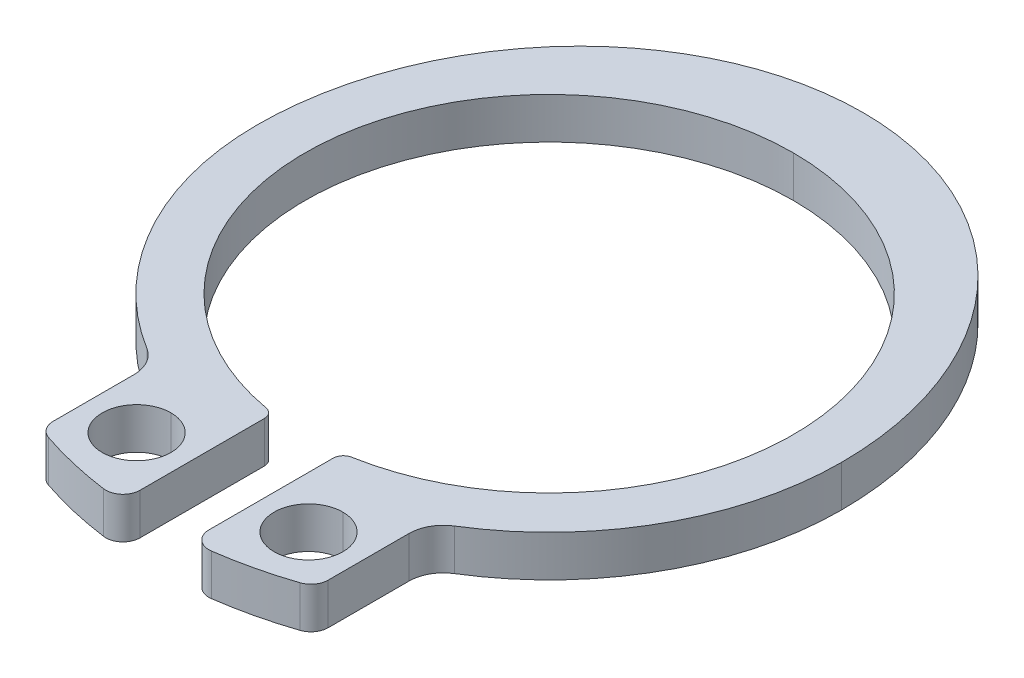
ISO-10303-21;
HEADER;
FILE_DESCRIPTION(('STEP AP214'),'2;1');
FILE_NAME('part.step','',(''),(''),'','','');
FILE_SCHEMA(('AUTOMOTIVE_DESIGN { 1 0 10303 214 1 1 1 1 }'));
ENDSEC;
DATA;
#1=APPLICATION_CONTEXT('core data for automotive mechanical design processes');
#2=APPLICATION_PROTOCOL_DEFINITION('international standard','automotive_design',2000,#1);
#3=PRODUCT_CONTEXT('',#1,'mechanical');
#4=PRODUCT('Part','Part','',(#3));
#5=PRODUCT_RELATED_PRODUCT_CATEGORY('part','',(#4));
#6=PRODUCT_DEFINITION_FORMATION('','',#4);
#7=PRODUCT_DEFINITION_CONTEXT('part definition',#1,'design');
#8=PRODUCT_DEFINITION('design','',#6,#7);
#9=PRODUCT_DEFINITION_SHAPE('','',#8);
#10=(LENGTH_UNIT() NAMED_UNIT(*) SI_UNIT(.MILLI.,.METRE.));
#11=(NAMED_UNIT(*) PLANE_ANGLE_UNIT() SI_UNIT($,.RADIAN.));
#12=(NAMED_UNIT(*) SI_UNIT($,.STERADIAN.) SOLID_ANGLE_UNIT());
#13=UNCERTAINTY_MEASURE_WITH_UNIT(LENGTH_MEASURE(1.E-05),#10,'distance_accuracy_value','');
#14=(GEOMETRIC_REPRESENTATION_CONTEXT(3) GLOBAL_UNCERTAINTY_ASSIGNED_CONTEXT((#13)) GLOBAL_UNIT_ASSIGNED_CONTEXT((#10,
#11,#12)) REPRESENTATION_CONTEXT('',''));
#15=CARTESIAN_POINT('',(0.,0.,0.));
#16=DIRECTION('',(0.,0.,1.));
#17=DIRECTION('',(1.,0.,0.));
#18=AXIS2_PLACEMENT_3D('',#15,#16,#17);
#19=CARTESIAN_POINT('',(8.5,1.2,0.));
#20=CARTESIAN_POINT('',(8.5,0.,0.));
#21=CARTESIAN_POINT('',(8.5,1.2,-5.347243652));
#22=CARTESIAN_POINT('',(8.5,0.,-5.347243652));
#23=CARTESIAN_POINT('',(4.97918472,1.2,-9.128315899));
#24=CARTESIAN_POINT('',(4.97918472,0.,-9.128315899));
#25=CARTESIAN_POINT('',(0.,1.2,-9.128315899));
#26=CARTESIAN_POINT('',(0.,0.,-9.128315899));
#27=(BOUNDED_SURFACE() B_SPLINE_SURFACE(3,1,((#19,#20),(#21,#22),(#23,#24),(#25,#26)),
.UNSPECIFIED.,.F.,.F.,.F.) B_SPLINE_SURFACE_WITH_KNOTS((4,4),(2,2),(0.,1.),(0.,1.),
.UNSPECIFIED.) GEOMETRIC_REPRESENTATION_ITEM() RATIONAL_B_SPLINE_SURFACE(((1.,1.),
(0.804737854124365,0.804737854124365),(0.804737854124365,0.804737854124365),(1.,1.))) REPRESENTATION_ITEM('') SURFACE());
#28=CARTESIAN_POINT('',(8.5,1.2,1.74337725500117E-09));
#29=CARTESIAN_POINT('',(8.5,1.2,-5.347243652));
#30=CARTESIAN_POINT('',(4.97918472,1.2,-9.128315899));
#31=CARTESIAN_POINT('',(0.,1.2,-9.128315899));
#32=(BOUNDED_CURVE() B_SPLINE_CURVE(3,(#28,#29,#30,#31),.UNSPECIFIED.,.F.,
.F.) B_SPLINE_CURVE_WITH_KNOTS((4,4),(0.,0.0138518875683567),
.UNSPECIFIED.) CURVE() GEOMETRIC_REPRESENTATION_ITEM() RATIONAL_B_SPLINE_CURVE((1.,
0.804737854124365,0.804737854124365,1.)) REPRESENTATION_ITEM(''));
#33=CARTESIAN_POINT('',(8.5,1.2,1.74337725500117E-09));
#34=VERTEX_POINT('',#33);
#35=CARTESIAN_POINT('',(0.,1.2,-9.128315899));
#36=VERTEX_POINT('',#35);
#37=EDGE_CURVE('E408',#34,#36,#32,.T.);
#38=DIRECTION('',(0.,-1.,0.));
#39=VECTOR('',#38,1.);
#40=CARTESIAN_POINT('',(8.5,0.6,1.74337725500117E-09));
#41=LINE('',#40,#39);
#42=CARTESIAN_POINT('',(8.5,0.,2.07655758405907E-10));
#43=VERTEX_POINT('',#42);
#44=EDGE_CURVE('E468',#34,#43,#41,.T.);
#45=CARTESIAN_POINT('',(8.5,0.,2.07655758405907E-10));
#46=CARTESIAN_POINT('',(8.5,0.,-5.347243652));
#47=CARTESIAN_POINT('',(4.97918472,0.,-9.128315899));
#48=CARTESIAN_POINT('',(0.,0.,-9.128315899));
#49=(BOUNDED_CURVE() B_SPLINE_CURVE(3,(#45,#46,#47,#48),.UNSPECIFIED.,.F.,
.F.) B_SPLINE_CURVE_WITH_KNOTS((4,4),(0.,0.0138518875683567),
.UNSPECIFIED.) CURVE() GEOMETRIC_REPRESENTATION_ITEM() RATIONAL_B_SPLINE_CURVE((1.,
0.804737854124365,0.804737854124365,1.)) REPRESENTATION_ITEM(''));
#50=CARTESIAN_POINT('',(0.,0.,-9.128315899));
#51=VERTEX_POINT('',#50);
#52=EDGE_CURVE('E296',#43,#51,#49,.T.);
#53=DIRECTION('',(0.,1.,0.));
#54=VECTOR('',#53,1.);
#55=CARTESIAN_POINT('',(0.,0.6,-9.128315899));
#56=LINE('',#55,#54);
#57=EDGE_CURVE('E11',#51,#36,#56,.T.);
#58=ORIENTED_EDGE('',*,*,#37,.F.);
#59=ORIENTED_EDGE('',*,*,#44,.T.);
#60=ORIENTED_EDGE('',*,*,#52,.T.);
#61=ORIENTED_EDGE('',*,*,#57,.T.);
#62=EDGE_LOOP('',(#58,#59,#60,#61));
#63=FACE_BOUND('',#62,.T.);
#64=ADVANCED_FACE('F16',(#63),#27,.F.);
#65=CARTESIAN_POINT('',(0.,1.2,-9.128315899));
#66=CARTESIAN_POINT('',(0.,0.,-9.128315899));
#67=CARTESIAN_POINT('',(-4.97918472,1.2,-9.128315899));
#68=CARTESIAN_POINT('',(-4.97918472,0.,-9.128315899));
#69=CARTESIAN_POINT('',(-8.5,1.2,-5.347243652));
#70=CARTESIAN_POINT('',(-8.5,0.,-5.347243652));
#71=CARTESIAN_POINT('',(-8.5,1.2,0.));
#72=CARTESIAN_POINT('',(-8.5,0.,0.));
#73=(BOUNDED_SURFACE() B_SPLINE_SURFACE(3,1,((#65,#66),(#67,#68),(#69,#70),(#71,#72)),
.UNSPECIFIED.,.F.,.F.,.F.) B_SPLINE_SURFACE_WITH_KNOTS((4,4),(2,2),(0.,1.),(0.,1.),
.UNSPECIFIED.) GEOMETRIC_REPRESENTATION_ITEM() RATIONAL_B_SPLINE_SURFACE(((1.,1.),
(0.804737854124365,0.804737854124365),(0.804737854124365,0.804737854124365),(1.,1.))) REPRESENTATION_ITEM('') SURFACE());
#74=CARTESIAN_POINT('',(0.,0.,-9.128315899));
#75=CARTESIAN_POINT('',(-4.97918472,0.,-9.128315899));
#76=CARTESIAN_POINT('',(-8.5,0.,-5.347243652));
#77=CARTESIAN_POINT('',(-8.5,0.,3.26986327615221E-09));
#78=(BOUNDED_CURVE() B_SPLINE_CURVE(3,(#74,#75,#76,#77),.UNSPECIFIED.,.F.,
.F.) B_SPLINE_CURVE_WITH_KNOTS((4,4),(0.,0.0138140315311749),
.UNSPECIFIED.) CURVE() GEOMETRIC_REPRESENTATION_ITEM() RATIONAL_B_SPLINE_CURVE((1.,
0.804737854124365,0.804737854124365,1.)) REPRESENTATION_ITEM(''));
#79=CARTESIAN_POINT('',(-8.5,0.,3.26986327615221E-09));
#80=VERTEX_POINT('',#79);
#81=EDGE_CURVE('E291',#51,#80,#78,.T.);
#82=DIRECTION('',(0.,1.,0.));
#83=VECTOR('',#82,1.);
#84=CARTESIAN_POINT('',(-8.5,0.6,3.26986327615221E-09));
#85=LINE('',#84,#83);
#86=CARTESIAN_POINT('',(-8.5,1.2,1.27619632007963E-09));
#87=VERTEX_POINT('',#86);
#88=EDGE_CURVE('E29',#80,#87,#85,.T.);
#89=CARTESIAN_POINT('',(0.,1.2,-9.128315899));
#90=CARTESIAN_POINT('',(-4.97918472,1.2,-9.128315899));
#91=CARTESIAN_POINT('',(-8.5,1.2,-5.347243652));
#92=CARTESIAN_POINT('',(-8.5,1.2,1.27619632007963E-09));
#93=(BOUNDED_CURVE() B_SPLINE_CURVE(3,(#89,#90,#91,#92),.UNSPECIFIED.,.F.,
.F.) B_SPLINE_CURVE_WITH_KNOTS((4,4),(0.,0.0138140315311749),
.UNSPECIFIED.) CURVE() GEOMETRIC_REPRESENTATION_ITEM() RATIONAL_B_SPLINE_CURVE((1.,
0.804737854124365,0.804737854124365,1.)) REPRESENTATION_ITEM(''));
#94=EDGE_CURVE('E402',#36,#87,#93,.T.);
#95=ORIENTED_EDGE('',*,*,#57,.F.);
#96=ORIENTED_EDGE('',*,*,#81,.T.);
#97=ORIENTED_EDGE('',*,*,#88,.T.);
#98=ORIENTED_EDGE('',*,*,#94,.F.);
#99=EDGE_LOOP('',(#95,#96,#97,#98));
#100=FACE_BOUND('',#99,.T.);
#101=ADVANCED_FACE('F18',(#100),#73,.F.);
#102=CARTESIAN_POINT('',(0.,1.2,0.));
#103=DIRECTION('',(0.,-1.,0.));
#104=DIRECTION('',(0.,0.,-1.));
#105=AXIS2_PLACEMENT_3D('',#102,#103,#104);
#106=CYLINDRICAL_SURFACE('',#105,8.5);
#107=DIRECTION('',(0.,-1.,0.));
#108=VECTOR('',#107,1.);
#109=CARTESIAN_POINT('',(-4.47368421091093,0.6,7.22745803068806));
#110=LINE('',#109,#108);
#111=CARTESIAN_POINT('',(-4.47368421065891,1.2,7.22745803069493));
#112=VERTEX_POINT('',#111);
#113=CARTESIAN_POINT('',(-4.47368421072565,0.,7.22745803080275));
#114=VERTEX_POINT('',#113);
#115=EDGE_CURVE('E324',#112,#114,#110,.T.);
#116=ORIENTED_EDGE('',*,*,#115,.F.);
#117=CARTESIAN_POINT('',(0.,1.2,0.));
#118=DIRECTION('',(0.,1.,0.));
#119=DIRECTION('',(0.,0.,-1.));
#120=AXIS2_PLACEMENT_3D('',#117,#118,#119);
#121=CIRCLE('',#120,8.5);
#122=EDGE_CURVE('E333',#87,#112,#121,.T.);
#123=ORIENTED_EDGE('',*,*,#122,.F.);
#124=ORIENTED_EDGE('',*,*,#88,.F.);
#125=CARTESIAN_POINT('',(0.,0.,0.));
#126=DIRECTION('',(0.,1.,0.));
#127=DIRECTION('',(0.,0.,-1.));
#128=AXIS2_PLACEMENT_3D('',#125,#126,#127);
#129=CIRCLE('',#128,8.5);
#130=EDGE_CURVE('E297',#80,#114,#129,.T.);
#131=ORIENTED_EDGE('',*,*,#130,.T.);
#132=EDGE_LOOP('',(#116,#123,#124,#131));
#133=FACE_BOUND('',#132,.T.);
#134=ADVANCED_FACE('F547',(#133),#106,.T.);
#135=CARTESIAN_POINT('',(-5.,1.2,8.077747211));
#136=DIRECTION('',(0.,-1.,0.));
#137=DIRECTION('',(0.,0.,-1.));
#138=AXIS2_PLACEMENT_3D('',#135,#136,#137);
#139=CYLINDRICAL_SURFACE('',#138,1.);
#140=CARTESIAN_POINT('',(-5.,1.2,8.077747211));
#141=DIRECTION('',(0.,-1.,0.));
#142=DIRECTION('',(0.,0.,-1.));
#143=AXIS2_PLACEMENT_3D('',#140,#141,#142);
#144=CIRCLE('',#143,1.);
#145=CARTESIAN_POINT('',(-4.000000001538,1.2,8.077747211));
#146=VERTEX_POINT('',#145);
#147=EDGE_CURVE('E329',#112,#146,#144,.T.);
#148=ORIENTED_EDGE('',*,*,#147,.F.);
#149=ORIENTED_EDGE('',*,*,#115,.T.);
#150=CARTESIAN_POINT('',(-5.,0.,8.077747211));
#151=DIRECTION('',(0.,-1.,0.));
#152=DIRECTION('',(0.,0.,-1.));
#153=AXIS2_PLACEMENT_3D('',#150,#151,#152);
#154=CIRCLE('',#153,1.);
#155=CARTESIAN_POINT('',(-4.000000001538,0.,8.077747211));
#156=VERTEX_POINT('',#155);
#157=EDGE_CURVE('E22',#114,#156,#154,.T.);
#158=ORIENTED_EDGE('',*,*,#157,.T.);
#159=DIRECTION('',(0.,1.,0.));
#160=VECTOR('',#159,1.);
#161=CARTESIAN_POINT('',(-4.,0.6,8.077747211));
#162=LINE('',#161,#160);
#163=EDGE_CURVE('E328',#156,#146,#162,.T.);
#164=ORIENTED_EDGE('',*,*,#163,.T.);
#165=EDGE_LOOP('',(#148,#149,#158,#164));
#166=FACE_BOUND('',#165,.T.);
#167=ADVANCED_FACE('F527',(#166),#139,.F.);
#168=CARTESIAN_POINT('',(-4.,0.,10.428326807));
#169=DIRECTION('',(1.,0.,0.));
#170=DIRECTION('',(0.,1.,0.));
#171=AXIS2_PLACEMENT_3D('',#168,#169,#170);
#172=PLANE('',#171);
#173=DIRECTION('',(0.,1.,0.));
#174=VECTOR('',#173,1.);
#175=CARTESIAN_POINT('',(-4.,0.6,10.4283268071923));
#176=LINE('',#175,#174);
#177=CARTESIAN_POINT('',(-4.000000001538,0.,10.4283268070962));
#178=VERTEX_POINT('',#177);
#179=CARTESIAN_POINT('',(-4.000000001538,1.2,10.4283268070962));
#180=VERTEX_POINT('',#179);
#181=EDGE_CURVE('E201',#178,#180,#176,.T.);
#182=ORIENTED_EDGE('',*,*,#181,.T.);
#183=DIRECTION('',(0.,0.,1.));
#184=VECTOR('',#183,1.);
#185=CARTESIAN_POINT('',(-4.000000003076,1.2,1.1344657295));
#186=LINE('',#185,#184);
#187=EDGE_CURVE('E311',#146,#180,#186,.T.);
#188=ORIENTED_EDGE('',*,*,#187,.F.);
#189=ORIENTED_EDGE('',*,*,#163,.F.);
#190=DIRECTION('',(0.,0.,1.));
#191=VECTOR('',#190,1.);
#192=CARTESIAN_POINT('',(-4.000000003076,0.,1.1344657295));
#193=LINE('',#192,#191);
#194=EDGE_CURVE('E284',#156,#178,#193,.T.);
#195=ORIENTED_EDGE('',*,*,#194,.T.);
#196=EDGE_LOOP('',(#182,#188,#189,#195));
#197=FACE_BOUND('',#196,.T.);
#198=ADVANCED_FACE('F538',(#197),#172,.F.);
#199=CARTESIAN_POINT('',(-3.5,1.2,10.428326807));
#200=DIRECTION('',(0.,-1.,0.));
#201=DIRECTION('',(0.,0.,-1.));
#202=AXIS2_PLACEMENT_3D('',#199,#200,#201);
#203=CYLINDRICAL_SURFACE('',#202,0.5);
#204=DIRECTION('',(0.,1.,0.));
#205=VECTOR('',#204,1.);
#206=CARTESIAN_POINT('',(-3.65909091058078,0.6,10.9023416616847));
#207=LINE('',#206,#205);
#208=CARTESIAN_POINT('',(-3.65909090988427,0.,10.9023416619184));
#209=VERTEX_POINT('',#208);
#210=CARTESIAN_POINT('',(-3.65909090983795,1.2,10.9023416617804));
#211=VERTEX_POINT('',#210);
#212=EDGE_CURVE('E216',#209,#211,#207,.T.);
#213=ORIENTED_EDGE('',*,*,#212,.T.);
#214=CARTESIAN_POINT('',(-3.5,1.2,10.428326807));
#215=DIRECTION('',(0.,1.,0.));
#216=DIRECTION('',(0.,0.,-1.));
#217=AXIS2_PLACEMENT_3D('',#214,#215,#216);
#218=CIRCLE('',#217,0.5);
#219=EDGE_CURVE('E306',#180,#211,#218,.T.);
#220=ORIENTED_EDGE('',*,*,#219,.F.);
#221=ORIENTED_EDGE('',*,*,#181,.F.);
#222=CARTESIAN_POINT('',(-3.5,0.,10.428326807));
#223=DIRECTION('',(0.,1.,0.));
#224=DIRECTION('',(0.,0.,-1.));
#225=AXIS2_PLACEMENT_3D('',#222,#223,#224);
#226=CIRCLE('',#225,0.5);
#227=EDGE_CURVE('E281',#178,#209,#226,.T.);
#228=ORIENTED_EDGE('',*,*,#227,.T.);
#229=EDGE_LOOP('',(#213,#220,#221,#228));
#230=FACE_BOUND('',#229,.T.);
#231=ADVANCED_FACE('F535',(#230),#203,.T.);
#232=CARTESIAN_POINT('',(0.,1.2,0.));
#233=DIRECTION('',(0.,-1.,0.));
#234=DIRECTION('',(0.,0.,-1.));
#235=AXIS2_PLACEMENT_3D('',#232,#233,#234);
#236=CYLINDRICAL_SURFACE('',#235,11.5);
#237=DIRECTION('',(0.,1.,0.));
#238=VECTOR('',#237,1.);
#239=CARTESIAN_POINT('',(-1.56818181842253,0.6,11.3925767843692));
#240=LINE('',#239,#238);
#241=CARTESIAN_POINT('',(-1.56818181830172,0.,11.3925767843858));
#242=VERTEX_POINT('',#241);
#243=CARTESIAN_POINT('',(-1.5681818182917,1.2,11.3925767843131));
#244=VERTEX_POINT('',#243);
#245=EDGE_CURVE('E391',#242,#244,#240,.T.);
#246=ORIENTED_EDGE('',*,*,#245,.T.);
#247=CARTESIAN_POINT('',(0.,1.2,0.));
#248=DIRECTION('',(0.,1.,0.));
#249=DIRECTION('',(0.,0.,-1.));
#250=AXIS2_PLACEMENT_3D('',#247,#248,#249);
#251=CIRCLE('',#250,11.5);
#252=EDGE_CURVE('E310',#211,#244,#251,.T.);
#253=ORIENTED_EDGE('',*,*,#252,.F.);
#254=ORIENTED_EDGE('',*,*,#212,.F.);
#255=CARTESIAN_POINT('',(0.,0.,0.));
#256=DIRECTION('',(0.,1.,0.));
#257=DIRECTION('',(0.,0.,-1.));
#258=AXIS2_PLACEMENT_3D('',#255,#256,#257);
#259=CIRCLE('',#258,11.5);
#260=EDGE_CURVE('E285',#209,#242,#259,.T.);
#261=ORIENTED_EDGE('',*,*,#260,.T.);
#262=EDGE_LOOP('',(#246,#253,#254,#261));
#263=FACE_BOUND('',#262,.T.);
#264=ADVANCED_FACE('F536',(#263),#236,.T.);
#265=CARTESIAN_POINT('',(-1.5,1.2,10.897247359));
#266=DIRECTION('',(0.,-1.,0.));
#267=DIRECTION('',(0.,0.,-1.));
#268=AXIS2_PLACEMENT_3D('',#265,#266,#267);
#269=CYLINDRICAL_SURFACE('',#268,0.5);
#270=DIRECTION('',(0.,1.,0.));
#271=VECTOR('',#270,1.);
#272=CARTESIAN_POINT('',(-1.,0.6,10.897247359));
#273=LINE('',#272,#271);
#274=CARTESIAN_POINT('',(-0.999999998233999,0.,10.897247359));
#275=VERTEX_POINT('',#274);
#276=CARTESIAN_POINT('',(-0.999999998233999,1.2,10.897247359));
#277=VERTEX_POINT('',#276);
#278=EDGE_CURVE('E395',#275,#277,#273,.T.);
#279=ORIENTED_EDGE('',*,*,#278,.T.);
#280=CARTESIAN_POINT('',(-1.5,1.2,10.897247359));
#281=DIRECTION('',(0.,1.,0.));
#282=DIRECTION('',(0.,0.,-1.));
#283=AXIS2_PLACEMENT_3D('',#280,#281,#282);
#284=CIRCLE('',#283,0.5);
#285=EDGE_CURVE('E290',#244,#277,#284,.T.);
#286=ORIENTED_EDGE('',*,*,#285,.F.);
#287=ORIENTED_EDGE('',*,*,#245,.F.);
#288=CARTESIAN_POINT('',(-1.5,0.,10.897247359));
#289=DIRECTION('',(0.,1.,0.));
#290=DIRECTION('',(0.,0.,-1.));
#291=AXIS2_PLACEMENT_3D('',#288,#289,#290);
#292=CIRCLE('',#291,0.5);
#293=EDGE_CURVE('E273',#242,#275,#292,.T.);
#294=ORIENTED_EDGE('',*,*,#293,.T.);
#295=EDGE_LOOP('',(#279,#286,#287,#294));
#296=FACE_BOUND('',#295,.T.);
#297=ADVANCED_FACE('F619',(#296),#269,.T.);
#298=CARTESIAN_POINT('',(-1.,0.,7.284915923));
#299=DIRECTION('',(-1.,0.,0.));
#300=DIRECTION('',(0.,0.,1.));
#301=AXIS2_PLACEMENT_3D('',#298,#299,#300);
#302=PLANE('',#301);
#303=DIRECTION('',(0.,1.,0.));
#304=VECTOR('',#303,1.);
#305=CARTESIAN_POINT('',(-1.,0.6,7.28491592306153));
#306=LINE('',#305,#304);
#307=CARTESIAN_POINT('',(-0.999999998233999,0.,7.28491592303077));
#308=VERTEX_POINT('',#307);
#309=CARTESIAN_POINT('',(-0.999999998233999,1.2,7.28491592303077));
#310=VERTEX_POINT('',#309);
#311=EDGE_CURVE('E357',#308,#310,#306,.T.);
#312=ORIENTED_EDGE('',*,*,#311,.T.);
#313=DIRECTION('',(0.,0.,-1.));
#314=VECTOR('',#313,1.);
#315=CARTESIAN_POINT('',(-0.999999996467998,1.2,1.1344657295));
#316=LINE('',#315,#314);
#317=EDGE_CURVE('E286',#277,#310,#316,.T.);
#318=ORIENTED_EDGE('',*,*,#317,.F.);
#319=ORIENTED_EDGE('',*,*,#278,.F.);
#320=DIRECTION('',(0.,0.,-1.));
#321=VECTOR('',#320,1.);
#322=CARTESIAN_POINT('',(-0.999999996467998,0.,1.1344657295));
#323=LINE('',#322,#321);
#324=EDGE_CURVE('E269',#275,#308,#323,.T.);
#325=ORIENTED_EDGE('',*,*,#324,.T.);
#326=EDGE_LOOP('',(#312,#318,#319,#325));
#327=FACE_BOUND('',#326,.T.);
#328=ADVANCED_FACE('F569',(#327),#302,.F.);
#329=CARTESIAN_POINT('',(-1.3,1.2,7.284915923));
#330=DIRECTION('',(0.,-1.,0.));
#331=DIRECTION('',(0.,0.,-1.));
#332=AXIS2_PLACEMENT_3D('',#329,#330,#331);
#333=CYLINDRICAL_SURFACE('',#332,0.3);
#334=DIRECTION('',(0.,-1.,0.));
#335=VECTOR('',#334,1.);
#336=CARTESIAN_POINT('',(-1.24729730079175,0.6,6.98958149272455));
#337=LINE('',#336,#335);
#338=CARTESIAN_POINT('',(-1.24729729904577,1.2,6.98958149321385));
#339=VERTEX_POINT('',#338);
#340=CARTESIAN_POINT('',(-1.24729729901503,0.,6.98958149304161));
#341=VERTEX_POINT('',#340);
#342=EDGE_CURVE('E354',#339,#341,#337,.T.);
#343=ORIENTED_EDGE('',*,*,#342,.F.);
#344=CARTESIAN_POINT('',(-1.3,1.2,7.284915923));
#345=DIRECTION('',(0.,1.,0.));
#346=DIRECTION('',(0.,0.,-1.));
#347=AXIS2_PLACEMENT_3D('',#344,#345,#346);
#348=CIRCLE('',#347,0.3);
#349=EDGE_CURVE('E267',#310,#339,#348,.T.);
#350=ORIENTED_EDGE('',*,*,#349,.F.);
#351=ORIENTED_EDGE('',*,*,#311,.F.);
#352=CARTESIAN_POINT('',(-1.3,0.,7.284915923));
#353=DIRECTION('',(0.,1.,0.));
#354=DIRECTION('',(0.,0.,-1.));
#355=AXIS2_PLACEMENT_3D('',#352,#353,#354);
#356=CIRCLE('',#355,0.3);
#357=EDGE_CURVE('E274',#308,#341,#356,.T.);
#358=ORIENTED_EDGE('',*,*,#357,.T.);
#359=EDGE_LOOP('',(#343,#350,#351,#358));
#360=FACE_BOUND('',#359,.T.);
#361=ADVANCED_FACE('F561',(#360),#333,.T.);
#362=CARTESIAN_POINT('',(0.,1.2,0.));
#363=DIRECTION('',(0.,-1.,0.));
#364=DIRECTION('',(0.,0.,-1.));
#365=AXIS2_PLACEMENT_3D('',#362,#363,#364);
#366=CYLINDRICAL_SURFACE('',#365,7.1);
#367=DIRECTION('',(0.,-1.,0.));
#368=VECTOR('',#367,1.);
#369=CARTESIAN_POINT('',(0.,1.2,-7.1));
#370=LINE('',#369,#368);
#371=CARTESIAN_POINT('',(0.,1.2,-7.1));
#372=VERTEX_POINT('',#371);
#373=CARTESIAN_POINT('',(0.,0.,-7.1));
#374=VERTEX_POINT('',#373);
#375=EDGE_CURVE('E370',#372,#374,#370,.T.);
#376=ORIENTED_EDGE('',*,*,#375,.F.);
#377=CARTESIAN_POINT('',(0.,1.2,0.));
#378=DIRECTION('',(0.,-1.,0.));
#379=DIRECTION('',(0.,0.,-1.));
#380=AXIS2_PLACEMENT_3D('',#377,#378,#379);
#381=CIRCLE('',#380,7.1);
#382=EDGE_CURVE('E128',#339,#372,#381,.T.);
#383=ORIENTED_EDGE('',*,*,#382,.F.);
#384=ORIENTED_EDGE('',*,*,#342,.T.);
#385=CARTESIAN_POINT('',(0.,0.,0.));
#386=DIRECTION('',(0.,-1.,0.));
#387=DIRECTION('',(0.,0.,-1.));
#388=AXIS2_PLACEMENT_3D('',#385,#386,#387);
#389=CIRCLE('',#388,7.1);
#390=EDGE_CURVE('E362',#341,#374,#389,.T.);
#391=ORIENTED_EDGE('',*,*,#390,.T.);
#392=EDGE_LOOP('',(#376,#383,#384,#391));
#393=FACE_BOUND('',#392,.T.);
#394=ADVANCED_FACE('F568',(#393),#366,.F.);
#395=CARTESIAN_POINT('',(1.3,1.2,7.284915923));
#396=DIRECTION('',(0.,-1.,0.));
#397=DIRECTION('',(0.,0.,-1.));
#398=AXIS2_PLACEMENT_3D('',#395,#396,#397);
#399=CYLINDRICAL_SURFACE('',#398,0.3);
#400=DIRECTION('',(0.,1.,0.));
#401=VECTOR('',#400,1.);
#402=CARTESIAN_POINT('',(1.,0.6,7.284915923));
#403=LINE('',#402,#401);
#404=CARTESIAN_POINT('',(0.999999998234001,0.,7.284915923));
#405=VERTEX_POINT('',#404);
#406=CARTESIAN_POINT('',(0.999999998234001,1.2,7.284915923));
#407=VERTEX_POINT('',#406);
#408=EDGE_CURVE('E358',#405,#407,#403,.T.);
#409=ORIENTED_EDGE('',*,*,#408,.T.);
#410=CARTESIAN_POINT('',(1.3,1.2,7.284915923));
#411=DIRECTION('',(0.,1.,0.));
#412=DIRECTION('',(0.,0.,-1.));
#413=AXIS2_PLACEMENT_3D('',#410,#411,#412);
#414=CIRCLE('',#413,0.3);
#415=CARTESIAN_POINT('',(1.24729729722803,1.2,6.98958149353823));
#416=VERTEX_POINT('',#415);
#417=EDGE_CURVE('E111',#416,#407,#414,.T.);
#418=ORIENTED_EDGE('',*,*,#417,.F.);
#419=DIRECTION('',(0.,1.,0.));
#420=VECTOR('',#419,1.);
#421=CARTESIAN_POINT('',(1.24729729721775,0.6,6.98958149371779));
#422=LINE('',#421,#420);
#423=CARTESIAN_POINT('',(1.24729729725877,0.,6.98958149371047));
#424=VERTEX_POINT('',#423);
#425=EDGE_CURVE('E336',#424,#416,#422,.T.);
#426=ORIENTED_EDGE('',*,*,#425,.F.);
#427=CARTESIAN_POINT('',(1.3,0.,7.284915923));
#428=DIRECTION('',(0.,1.,0.));
#429=DIRECTION('',(0.,0.,-1.));
#430=AXIS2_PLACEMENT_3D('',#427,#428,#429);
#431=CIRCLE('',#430,0.3);
#432=EDGE_CURVE('E323',#424,#405,#431,.T.);
#433=ORIENTED_EDGE('',*,*,#432,.T.);
#434=EDGE_LOOP('',(#409,#418,#426,#433));
#435=FACE_BOUND('',#434,.T.);
#436=ADVANCED_FACE('F681',(#435),#399,.T.);
#437=CARTESIAN_POINT('',(1.,0.,10.897247359));
#438=DIRECTION('',(1.,0.,0.));
#439=DIRECTION('',(0.,1.,0.));
#440=AXIS2_PLACEMENT_3D('',#437,#438,#439);
#441=PLANE('',#440);
#442=DIRECTION('',(0.,1.,0.));
#443=VECTOR('',#442,1.);
#444=CARTESIAN_POINT('',(1.,0.6,10.8972473591923));
#445=LINE('',#444,#443);
#446=CARTESIAN_POINT('',(0.999999998234,0.,10.8972473590962));
#447=VERTEX_POINT('',#446);
#448=CARTESIAN_POINT('',(0.999999998234,1.2,10.8972473590962));
#449=VERTEX_POINT('',#448);
#450=EDGE_CURVE('E245',#447,#449,#445,.T.);
#451=ORIENTED_EDGE('',*,*,#450,.T.);
#452=DIRECTION('',(0.,0.,1.));
#453=VECTOR('',#452,1.);
#454=CARTESIAN_POINT('',(0.999999996468002,1.2,1.1344657295));
#455=LINE('',#454,#453);
#456=EDGE_CURVE('E257',#407,#449,#455,.T.);
#457=ORIENTED_EDGE('',*,*,#456,.F.);
#458=ORIENTED_EDGE('',*,*,#408,.F.);
#459=DIRECTION('',(0.,0.,1.));
#460=VECTOR('',#459,1.);
#461=CARTESIAN_POINT('',(0.999999996468002,0.,1.1344657295));
#462=LINE('',#461,#460);
#463=EDGE_CURVE('E319',#405,#447,#462,.T.);
#464=ORIENTED_EDGE('',*,*,#463,.T.);
#465=EDGE_LOOP('',(#451,#457,#458,#464));
#466=FACE_BOUND('',#465,.T.);
#467=ADVANCED_FACE('F661',(#466),#441,.F.);
#468=CARTESIAN_POINT('',(1.5,1.2,10.897247359));
#469=DIRECTION('',(0.,-1.,0.));
#470=DIRECTION('',(0.,0.,-1.));
#471=AXIS2_PLACEMENT_3D('',#468,#469,#470);
#472=CYLINDRICAL_SURFACE('',#471,0.5);
#473=DIRECTION('',(0.,1.,0.));
#474=VECTOR('',#473,1.);
#475=CARTESIAN_POINT('',(1.56818181437154,0.6,11.3925767847785));
#476=LINE('',#475,#474);
#477=CARTESIAN_POINT('',(1.56818181626621,0.,11.3925767845177));
#478=VERTEX_POINT('',#477);
#479=CARTESIAN_POINT('',(1.56818181627623,1.2,11.3925767845905));
#480=VERTEX_POINT('',#479);
#481=EDGE_CURVE('E236',#478,#480,#476,.T.);
#482=ORIENTED_EDGE('',*,*,#481,.T.);
#483=CARTESIAN_POINT('',(1.5,1.2,10.897247359));
#484=DIRECTION('',(0.,1.,0.));
#485=DIRECTION('',(0.,0.,-1.));
#486=AXIS2_PLACEMENT_3D('',#483,#484,#485);
#487=CIRCLE('',#486,0.5);
#488=EDGE_CURVE('E239',#449,#480,#487,.T.);
#489=ORIENTED_EDGE('',*,*,#488,.F.);
#490=ORIENTED_EDGE('',*,*,#450,.F.);
#491=CARTESIAN_POINT('',(1.5,0.,10.897247359));
#492=DIRECTION('',(0.,1.,0.));
#493=DIRECTION('',(0.,0.,-1.));
#494=AXIS2_PLACEMENT_3D('',#491,#492,#493);
#495=CIRCLE('',#494,0.5);
#496=EDGE_CURVE('E242',#447,#478,#495,.T.);
#497=ORIENTED_EDGE('',*,*,#496,.T.);
#498=EDGE_LOOP('',(#482,#489,#490,#497));
#499=FACE_BOUND('',#498,.T.);
#500=ADVANCED_FACE('F237',(#499),#472,.T.);
#501=CARTESIAN_POINT('',(0.,1.2,0.));
#502=DIRECTION('',(0.,-1.,0.));
#503=DIRECTION('',(0.,0.,-1.));
#504=AXIS2_PLACEMENT_3D('',#501,#502,#503);
#505=CYLINDRICAL_SURFACE('',#504,11.5);
#506=DIRECTION('',(0.,1.,0.));
#507=VECTOR('',#506,1.);
#508=CARTESIAN_POINT('',(3.65909090924082,0.6,10.9023416618273));
#509=LINE('',#508,#507);
#510=CARTESIAN_POINT('',(3.65909090916797,0.,10.9023416618517));
#511=VERTEX_POINT('',#510);
#512=CARTESIAN_POINT('',(3.65909090921429,1.2,10.9023416619897));
#513=VERTEX_POINT('',#512);
#514=EDGE_CURVE('E227',#511,#513,#509,.T.);
#515=ORIENTED_EDGE('',*,*,#514,.T.);
#516=CARTESIAN_POINT('',(0.,1.2,0.));
#517=DIRECTION('',(0.,1.,0.));
#518=DIRECTION('',(0.,0.,-1.));
#519=AXIS2_PLACEMENT_3D('',#516,#517,#518);
#520=CIRCLE('',#519,11.5);
#521=EDGE_CURVE('E248',#480,#513,#520,.T.);
#522=ORIENTED_EDGE('',*,*,#521,.F.);
#523=ORIENTED_EDGE('',*,*,#481,.F.);
#524=CARTESIAN_POINT('',(0.,0.,0.));
#525=DIRECTION('',(0.,1.,0.));
#526=DIRECTION('',(0.,0.,-1.));
#527=AXIS2_PLACEMENT_3D('',#524,#525,#526);
#528=CIRCLE('',#527,11.5);
#529=EDGE_CURVE('E352',#478,#511,#528,.T.);
#530=ORIENTED_EDGE('',*,*,#529,.T.);
#531=EDGE_LOOP('',(#515,#522,#523,#530));
#532=FACE_BOUND('',#531,.T.);
#533=ADVANCED_FACE('F249',(#532),#505,.T.);
#534=CARTESIAN_POINT('',(3.5,1.2,10.428326807));
#535=DIRECTION('',(0.,-1.,0.));
#536=DIRECTION('',(0.,0.,-1.));
#537=AXIS2_PLACEMENT_3D('',#534,#535,#536);
#538=CYLINDRICAL_SURFACE('',#537,0.5);
#539=DIRECTION('',(0.,1.,0.));
#540=VECTOR('',#539,1.);
#541=CARTESIAN_POINT('',(4.,0.6,10.428326807));
#542=LINE('',#541,#540);
#543=CARTESIAN_POINT('',(4.000000001538,0.,10.428326807));
#544=VERTEX_POINT('',#543);
#545=CARTESIAN_POINT('',(4.000000001538,1.2,10.428326807));
#546=VERTEX_POINT('',#545);
#547=EDGE_CURVE('E312',#544,#546,#542,.T.);
#548=ORIENTED_EDGE('',*,*,#547,.T.);
#549=CARTESIAN_POINT('',(3.5,1.2,10.428326807));
#550=DIRECTION('',(0.,1.,0.));
#551=DIRECTION('',(0.,0.,-1.));
#552=AXIS2_PLACEMENT_3D('',#549,#550,#551);
#553=CIRCLE('',#552,0.5);
#554=EDGE_CURVE('E252',#513,#546,#553,.T.);
#555=ORIENTED_EDGE('',*,*,#554,.F.);
#556=ORIENTED_EDGE('',*,*,#514,.F.);
#557=CARTESIAN_POINT('',(3.5,0.,10.428326807));
#558=DIRECTION('',(0.,1.,0.));
#559=DIRECTION('',(0.,0.,-1.));
#560=AXIS2_PLACEMENT_3D('',#557,#558,#559);
#561=CIRCLE('',#560,0.5);
#562=EDGE_CURVE('E348',#511,#544,#561,.T.);
#563=ORIENTED_EDGE('',*,*,#562,.T.);
#564=EDGE_LOOP('',(#548,#555,#556,#563));
#565=FACE_BOUND('',#564,.T.);
#566=ADVANCED_FACE('F656',(#565),#538,.T.);
#567=CARTESIAN_POINT('',(4.,0.,8.077747211));
#568=DIRECTION('',(-1.,0.,0.));
#569=DIRECTION('',(0.,0.,1.));
#570=AXIS2_PLACEMENT_3D('',#567,#568,#569);
#571=PLANE('',#570);
#572=DIRECTION('',(0.,-1.,0.));
#573=VECTOR('',#572,1.);
#574=CARTESIAN_POINT('',(4.,0.6,8.07774721138469));
#575=LINE('',#574,#573);
#576=CARTESIAN_POINT('',(4.000000001538,1.2,8.07774721119235));
#577=VERTEX_POINT('',#576);
#578=CARTESIAN_POINT('',(4.000000001538,0.,8.07774721119235));
#579=VERTEX_POINT('',#578);
#580=EDGE_CURVE('E315',#577,#579,#575,.T.);
#581=ORIENTED_EDGE('',*,*,#580,.F.);
#582=DIRECTION('',(0.,0.,-1.));
#583=VECTOR('',#582,1.);
#584=CARTESIAN_POINT('',(4.000000003076,1.2,1.1344657295));
#585=LINE('',#584,#583);
#586=EDGE_CURVE('E377',#546,#577,#585,.T.);
#587=ORIENTED_EDGE('',*,*,#586,.F.);
#588=ORIENTED_EDGE('',*,*,#547,.F.);
#589=DIRECTION('',(0.,0.,-1.));
#590=VECTOR('',#589,1.);
#591=CARTESIAN_POINT('',(4.000000003076,0.,1.1344657295));
#592=LINE('',#591,#590);
#593=EDGE_CURVE('E353',#544,#579,#592,.T.);
#594=ORIENTED_EDGE('',*,*,#593,.T.);
#595=EDGE_LOOP('',(#581,#587,#588,#594));
#596=FACE_BOUND('',#595,.T.);
#597=ADVANCED_FACE('F582',(#596),#571,.F.);
#598=CARTESIAN_POINT('',(5.,1.2,8.077747211));
#599=DIRECTION('',(0.,-1.,0.));
#600=DIRECTION('',(0.,0.,-1.));
#601=AXIS2_PLACEMENT_3D('',#598,#599,#600);
#602=CYLINDRICAL_SURFACE('',#601,1.);
#603=CARTESIAN_POINT('',(5.,1.2,8.077747211));
#604=DIRECTION('',(0.,-1.,0.));
#605=DIRECTION('',(0.,0.,-1.));
#606=AXIS2_PLACEMENT_3D('',#603,#604,#605);
#607=CIRCLE('',#606,1.);
#608=CARTESIAN_POINT('',(4.4736842110301,1.2,7.22745803046518));
#609=VERTEX_POINT('',#608);
#610=EDGE_CURVE('E304',#577,#609,#607,.T.);
#611=ORIENTED_EDGE('',*,*,#610,.F.);
#612=ORIENTED_EDGE('',*,*,#580,.T.);
#613=CARTESIAN_POINT('',(5.,0.,8.077747211));
#614=DIRECTION('',(0.,-1.,0.));
#615=DIRECTION('',(0.,0.,-1.));
#616=AXIS2_PLACEMENT_3D('',#613,#614,#615);
#617=CIRCLE('',#616,1.);
#618=CARTESIAN_POINT('',(4.47368421096337,0.,7.22745803035736));
#619=VERTEX_POINT('',#618);
#620=EDGE_CURVE('E382',#579,#619,#617,.T.);
#621=ORIENTED_EDGE('',*,*,#620,.T.);
#622=DIRECTION('',(0.,1.,0.));
#623=VECTOR('',#622,1.);
#624=CARTESIAN_POINT('',(4.47368421151983,0.6,7.22745803001291));
#625=LINE('',#624,#623);
#626=EDGE_CURVE('E386',#619,#609,#625,.T.);
#627=ORIENTED_EDGE('',*,*,#626,.T.);
#628=EDGE_LOOP('',(#611,#612,#621,#627));
#629=FACE_BOUND('',#628,.T.);
#630=ADVANCED_FACE('F574',(#629),#602,.F.);
#631=CARTESIAN_POINT('',(0.,1.2,0.));
#632=DIRECTION('',(0.,-1.,0.));
#633=DIRECTION('',(0.,0.,-1.));
#634=AXIS2_PLACEMENT_3D('',#631,#632,#633);
#635=CYLINDRICAL_SURFACE('',#634,8.5);
#636=ORIENTED_EDGE('',*,*,#44,.F.);
#637=CARTESIAN_POINT('',(0.,1.2,0.));
#638=DIRECTION('',(0.,1.,0.));
#639=DIRECTION('',(0.,0.,-1.));
#640=AXIS2_PLACEMENT_3D('',#637,#638,#639);
#641=CIRCLE('',#640,8.5);
#642=EDGE_CURVE('E453',#609,#34,#641,.T.);
#643=ORIENTED_EDGE('',*,*,#642,.F.);
#644=ORIENTED_EDGE('',*,*,#626,.F.);
#645=CARTESIAN_POINT('',(0.,0.,0.));
#646=DIRECTION('',(0.,1.,0.));
#647=DIRECTION('',(0.,0.,-1.));
#648=AXIS2_PLACEMENT_3D('',#645,#646,#647);
#649=CIRCLE('',#648,8.5);
#650=EDGE_CURVE('E378',#619,#43,#649,.T.);
#651=ORIENTED_EDGE('',*,*,#650,.T.);
#652=EDGE_LOOP('',(#636,#643,#644,#651));
#653=FACE_BOUND('',#652,.T.);
#654=ADVANCED_FACE('F571',(#653),#635,.T.);
#655=CARTESIAN_POINT('',(-2.5,0.,9.5));
#656=DIRECTION('',(0.,1.,0.));
#657=DIRECTION('',(0.,0.,1.));
#658=AXIS2_PLACEMENT_3D('',#655,#656,#657);
#659=CYLINDRICAL_SURFACE('',#658,1.);
#660=DIRECTION('',(0.,1.,0.));
#661=VECTOR('',#660,1.);
#662=CARTESIAN_POINT('',(-2.5,0.,8.5));
#663=LINE('',#662,#661);
#664=CARTESIAN_POINT('',(-2.5,0.,8.5));
#665=VERTEX_POINT('',#664);
#666=CARTESIAN_POINT('',(-2.5,1.2,8.5));
#667=VERTEX_POINT('',#666);
#668=EDGE_CURVE('E279',#665,#667,#663,.T.);
#669=ORIENTED_EDGE('',*,*,#668,.F.);
#670=CARTESIAN_POINT('',(-2.5,0.,9.5));
#671=DIRECTION('',(0.,-1.,0.));
#672=DIRECTION('',(0.,0.,1.));
#673=AXIS2_PLACEMENT_3D('',#670,#671,#672);
#674=CIRCLE('',#673,1.);
#675=CARTESIAN_POINT('',(-2.5,0.,10.5));
#676=VERTEX_POINT('',#675);
#677=EDGE_CURVE('E465',#665,#676,#674,.T.);
#678=ORIENTED_EDGE('',*,*,#677,.T.);
#679=DIRECTION('',(0.,1.,0.));
#680=VECTOR('',#679,1.);
#681=CARTESIAN_POINT('',(-2.5,0.,10.5));
#682=LINE('',#681,#680);
#683=CARTESIAN_POINT('',(-2.5,1.2,10.5));
#684=VERTEX_POINT('',#683);
#685=EDGE_CURVE('E337',#676,#684,#682,.T.);
#686=ORIENTED_EDGE('',*,*,#685,.T.);
#687=CARTESIAN_POINT('',(-2.5,1.2,9.5));
#688=DIRECTION('',(0.,-1.,0.));
#689=DIRECTION('',(0.,0.,1.));
#690=AXIS2_PLACEMENT_3D('',#687,#688,#689);
#691=CIRCLE('',#690,1.);
#692=EDGE_CURVE('E383',#667,#684,#691,.T.);
#693=ORIENTED_EDGE('',*,*,#692,.F.);
#694=EDGE_LOOP('',(#669,#678,#686,#693));
#695=FACE_BOUND('',#694,.T.);
#696=ADVANCED_FACE('F573',(#695),#659,.F.);
#697=CARTESIAN_POINT('',(-8.602,0.,-9.251469279));
#698=DIRECTION('',(0.,1.,0.));
#699=DIRECTION('',(1.,0.,0.));
#700=AXIS2_PLACEMENT_3D('',#697,#698,#699);
#701=PLANE('',#700);
#702=CARTESIAN_POINT('',(2.5,0.,9.5));
#703=DIRECTION('',(0.,-1.,0.));
#704=DIRECTION('',(0.,0.,1.));
#705=AXIS2_PLACEMENT_3D('',#702,#703,#704);
#706=CIRCLE('',#705,1.);
#707=CARTESIAN_POINT('',(2.5,0.,10.5));
#708=VERTEX_POINT('',#707);
#709=CARTESIAN_POINT('',(2.5,0.,8.5));
#710=VERTEX_POINT('',#709);
#711=EDGE_CURVE('E415',#708,#710,#706,.T.);
#712=ORIENTED_EDGE('',*,*,#711,.F.);
#713=CARTESIAN_POINT('',(2.5,0.,9.5));
#714=DIRECTION('',(0.,-1.,0.));
#715=DIRECTION('',(0.,0.,1.));
#716=AXIS2_PLACEMENT_3D('',#713,#714,#715);
#717=CIRCLE('',#716,1.);
#718=EDGE_CURVE('E305',#710,#708,#717,.T.);
#719=ORIENTED_EDGE('',*,*,#718,.F.);
#720=EDGE_LOOP('',(#712,#719));
#721=FACE_BOUND('',#720,.T.);
#722=CARTESIAN_POINT('',(-2.5,0.,9.5));
#723=DIRECTION('',(0.,-1.,0.));
#724=DIRECTION('',(0.,0.,1.));
#725=AXIS2_PLACEMENT_3D('',#722,#723,#724);
#726=CIRCLE('',#725,1.);
#727=EDGE_CURVE('E275',#676,#665,#726,.T.);
#728=ORIENTED_EDGE('',*,*,#727,.F.);
#729=ORIENTED_EDGE('',*,*,#677,.F.);
#730=EDGE_LOOP('',(#728,#729));
#731=FACE_BOUND('',#730,.T.);
#732=ORIENTED_EDGE('',*,*,#650,.F.);
#733=ORIENTED_EDGE('',*,*,#620,.F.);
#734=ORIENTED_EDGE('',*,*,#593,.F.);
#735=ORIENTED_EDGE('',*,*,#562,.F.);
#736=ORIENTED_EDGE('',*,*,#529,.F.);
#737=ORIENTED_EDGE('',*,*,#496,.F.);
#738=ORIENTED_EDGE('',*,*,#463,.F.);
#739=ORIENTED_EDGE('',*,*,#432,.F.);
#740=CARTESIAN_POINT('',(0.,0.,0.));
#741=DIRECTION('',(0.,-1.,0.));
#742=DIRECTION('',(0.,0.,-1.));
#743=AXIS2_PLACEMENT_3D('',#740,#741,#742);
#744=CIRCLE('',#743,7.1);
#745=EDGE_CURVE('E374',#374,#424,#744,.T.);
#746=ORIENTED_EDGE('',*,*,#745,.F.);
#747=ORIENTED_EDGE('',*,*,#390,.F.);
#748=ORIENTED_EDGE('',*,*,#357,.F.);
#749=ORIENTED_EDGE('',*,*,#324,.F.);
#750=ORIENTED_EDGE('',*,*,#293,.F.);
#751=ORIENTED_EDGE('',*,*,#260,.F.);
#752=ORIENTED_EDGE('',*,*,#227,.F.);
#753=ORIENTED_EDGE('',*,*,#194,.F.);
#754=ORIENTED_EDGE('',*,*,#157,.F.);
#755=ORIENTED_EDGE('',*,*,#130,.F.);
#756=ORIENTED_EDGE('',*,*,#81,.F.);
#757=ORIENTED_EDGE('',*,*,#52,.F.);
#758=EDGE_LOOP('',(#732,#733,#734,#735,#736,#737,#738,#739,#746,#747,#748,#749,#750,#751,#752,
#753,#754,#755,#756,#757));
#759=FACE_BOUND('',#758,.T.);
#760=ADVANCED_FACE('F532',(#721,#731,#759),#701,.F.);
#761=CARTESIAN_POINT('',(-8.602,1.2,-9.251469279));
#762=DIRECTION('',(0.,1.,0.));
#763=DIRECTION('',(1.,0.,0.));
#764=AXIS2_PLACEMENT_3D('',#761,#762,#763);
#765=PLANE('',#764);
#766=CARTESIAN_POINT('',(2.5,1.2,9.5));
#767=DIRECTION('',(0.,1.,0.));
#768=DIRECTION('',(0.,0.,1.));
#769=AXIS2_PLACEMENT_3D('',#766,#767,#768);
#770=CIRCLE('',#769,1.);
#771=CARTESIAN_POINT('',(2.5,1.2,10.5));
#772=VERTEX_POINT('',#771);
#773=CARTESIAN_POINT('',(2.5,1.2,8.5));
#774=VERTEX_POINT('',#773);
#775=EDGE_CURVE('E298',#772,#774,#770,.T.);
#776=ORIENTED_EDGE('',*,*,#775,.F.);
#777=CARTESIAN_POINT('',(2.5,1.2,9.5));
#778=DIRECTION('',(0.,1.,0.));
#779=DIRECTION('',(0.,0.,1.));
#780=AXIS2_PLACEMENT_3D('',#777,#778,#779);
#781=CIRCLE('',#780,1.);
#782=EDGE_CURVE('E369',#774,#772,#781,.T.);
#783=ORIENTED_EDGE('',*,*,#782,.F.);
#784=EDGE_LOOP('',(#776,#783));
#785=FACE_BOUND('',#784,.T.);
#786=CARTESIAN_POINT('',(-2.5,1.2,9.5));
#787=DIRECTION('',(0.,-1.,0.));
#788=DIRECTION('',(0.,0.,1.));
#789=AXIS2_PLACEMENT_3D('',#786,#787,#788);
#790=CIRCLE('',#789,1.);
#791=EDGE_CURVE('E342',#684,#667,#790,.T.);
#792=ORIENTED_EDGE('',*,*,#791,.T.);
#793=ORIENTED_EDGE('',*,*,#692,.T.);
#794=EDGE_LOOP('',(#792,#793));
#795=FACE_BOUND('',#794,.T.);
#796=ORIENTED_EDGE('',*,*,#610,.T.);
#797=ORIENTED_EDGE('',*,*,#642,.T.);
#798=ORIENTED_EDGE('',*,*,#37,.T.);
#799=ORIENTED_EDGE('',*,*,#94,.T.);
#800=ORIENTED_EDGE('',*,*,#122,.T.);
#801=ORIENTED_EDGE('',*,*,#147,.T.);
#802=ORIENTED_EDGE('',*,*,#187,.T.);
#803=ORIENTED_EDGE('',*,*,#219,.T.);
#804=ORIENTED_EDGE('',*,*,#252,.T.);
#805=ORIENTED_EDGE('',*,*,#285,.T.);
#806=ORIENTED_EDGE('',*,*,#317,.T.);
#807=ORIENTED_EDGE('',*,*,#349,.T.);
#808=ORIENTED_EDGE('',*,*,#382,.T.);
#809=CARTESIAN_POINT('',(0.,1.2,0.));
#810=DIRECTION('',(0.,-1.,0.));
#811=DIRECTION('',(0.,0.,-1.));
#812=AXIS2_PLACEMENT_3D('',#809,#810,#811);
#813=CIRCLE('',#812,7.1);
#814=EDGE_CURVE('E341',#372,#416,#813,.T.);
#815=ORIENTED_EDGE('',*,*,#814,.T.);
#816=ORIENTED_EDGE('',*,*,#417,.T.);
#817=ORIENTED_EDGE('',*,*,#456,.T.);
#818=ORIENTED_EDGE('',*,*,#488,.T.);
#819=ORIENTED_EDGE('',*,*,#521,.T.);
#820=ORIENTED_EDGE('',*,*,#554,.T.);
#821=ORIENTED_EDGE('',*,*,#586,.T.);
#822=EDGE_LOOP('',(#796,#797,#798,#799,#800,#801,#802,#803,#804,#805,#806,#807,#808,#815,#816,
#817,#818,#819,#820,#821));
#823=FACE_BOUND('',#822,.T.);
#824=ADVANCED_FACE('F255',(#785,#795,#823),#765,.T.);
#825=CARTESIAN_POINT('',(2.5,0.,9.5));
#826=DIRECTION('',(0.,1.,0.));
#827=DIRECTION('',(0.,0.,1.));
#828=AXIS2_PLACEMENT_3D('',#825,#826,#827);
#829=CYLINDRICAL_SURFACE('',#828,1.);
#830=DIRECTION('',(0.,1.,0.));
#831=VECTOR('',#830,1.);
#832=CARTESIAN_POINT('',(2.5,0.,8.5));
#833=LINE('',#832,#831);
#834=EDGE_CURVE('E401',#710,#774,#833,.T.);
#835=ORIENTED_EDGE('',*,*,#834,.F.);
#836=ORIENTED_EDGE('',*,*,#718,.T.);
#837=DIRECTION('',(0.,1.,0.));
#838=VECTOR('',#837,1.);
#839=CARTESIAN_POINT('',(2.5,0.,10.5));
#840=LINE('',#839,#838);
#841=EDGE_CURVE('E280',#708,#772,#840,.T.);
#842=ORIENTED_EDGE('',*,*,#841,.T.);
#843=ORIENTED_EDGE('',*,*,#775,.T.);
#844=EDGE_LOOP('',(#835,#836,#842,#843));
#845=FACE_BOUND('',#844,.T.);
#846=ADVANCED_FACE('F636',(#845),#829,.F.);
#847=CARTESIAN_POINT('',(0.,1.2,0.));
#848=DIRECTION('',(0.,-1.,0.));
#849=DIRECTION('',(0.,0.,-1.));
#850=AXIS2_PLACEMENT_3D('',#847,#848,#849);
#851=CYLINDRICAL_SURFACE('',#850,7.1);
#852=ORIENTED_EDGE('',*,*,#814,.F.);
#853=ORIENTED_EDGE('',*,*,#375,.T.);
#854=ORIENTED_EDGE('',*,*,#745,.T.);
#855=ORIENTED_EDGE('',*,*,#425,.T.);
#856=EDGE_LOOP('',(#852,#853,#854,#855));
#857=FACE_BOUND('',#856,.T.);
#858=ADVANCED_FACE('F651',(#857),#851,.F.);
#859=CARTESIAN_POINT('',(-2.5,0.,9.5));
#860=DIRECTION('',(0.,1.,0.));
#861=DIRECTION('',(0.,0.,1.));
#862=AXIS2_PLACEMENT_3D('',#859,#860,#861);
#863=CYLINDRICAL_SURFACE('',#862,1.);
#864=ORIENTED_EDGE('',*,*,#727,.T.);
#865=ORIENTED_EDGE('',*,*,#668,.T.);
#866=ORIENTED_EDGE('',*,*,#791,.F.);
#867=ORIENTED_EDGE('',*,*,#685,.F.);
#868=EDGE_LOOP('',(#864,#865,#866,#867));
#869=FACE_BOUND('',#868,.T.);
#870=ADVANCED_FACE('F645',(#869),#863,.F.);
#871=CARTESIAN_POINT('',(2.5,0.,9.5));
#872=DIRECTION('',(0.,1.,0.));
#873=DIRECTION('',(0.,0.,1.));
#874=AXIS2_PLACEMENT_3D('',#871,#872,#873);
#875=CYLINDRICAL_SURFACE('',#874,1.);
#876=ORIENTED_EDGE('',*,*,#711,.T.);
#877=ORIENTED_EDGE('',*,*,#834,.T.);
#878=ORIENTED_EDGE('',*,*,#782,.T.);
#879=ORIENTED_EDGE('',*,*,#841,.F.);
#880=EDGE_LOOP('',(#876,#877,#878,#879));
#881=FACE_BOUND('',#880,.T.);
#882=ADVANCED_FACE('F639',(#881),#875,.F.);
#883=CLOSED_SHELL('',(#64,#101,#134,#167,#198,#231,#264,#297,#328,#361,#394,#436,#467,#500,#533,
#566,#597,#630,#654,#696,#760,#824,#846,#858,#870,#882));
#884=MANIFOLD_SOLID_BREP('B1',#883);
#885=ADVANCED_BREP_SHAPE_REPRESENTATION('',(#18,#884),#14);
#886=SHAPE_DEFINITION_REPRESENTATION(#9,#885);
ENDSEC;
END-ISO-10303-21;
